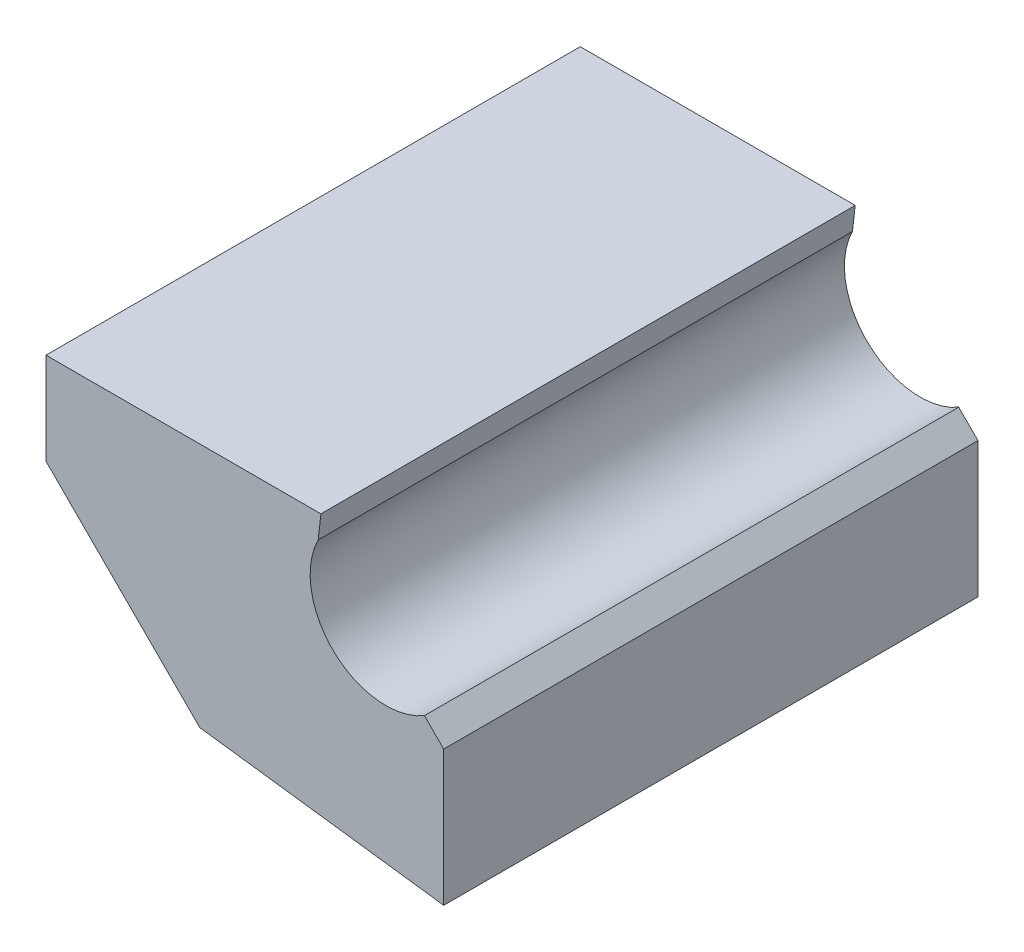
ISO-10303-21;
HEADER;
FILE_DESCRIPTION(('STEP AP214'),'2;1');
FILE_NAME('part.step','',(''),(''),'','','');
FILE_SCHEMA(('AUTOMOTIVE_DESIGN { 1 0 10303 214 1 1 1 1 }'));
ENDSEC;
DATA;
#1=APPLICATION_CONTEXT('core data for automotive mechanical design processes');
#2=APPLICATION_PROTOCOL_DEFINITION('international standard','automotive_design',2000,#1);
#3=PRODUCT_CONTEXT('',#1,'mechanical');
#4=PRODUCT('Part','Part','',(#3));
#5=PRODUCT_RELATED_PRODUCT_CATEGORY('part','',(#4));
#6=PRODUCT_DEFINITION_FORMATION('','',#4);
#7=PRODUCT_DEFINITION_CONTEXT('part definition',#1,'design');
#8=PRODUCT_DEFINITION('design','',#6,#7);
#9=PRODUCT_DEFINITION_SHAPE('','',#8);
#10=(LENGTH_UNIT() NAMED_UNIT(*) SI_UNIT(.MILLI.,.METRE.));
#11=(NAMED_UNIT(*) PLANE_ANGLE_UNIT() SI_UNIT($,.RADIAN.));
#12=(NAMED_UNIT(*) SI_UNIT($,.STERADIAN.) SOLID_ANGLE_UNIT());
#13=UNCERTAINTY_MEASURE_WITH_UNIT(LENGTH_MEASURE(1.E-05),#10,'distance_accuracy_value','');
#14=(GEOMETRIC_REPRESENTATION_CONTEXT(3) GLOBAL_UNCERTAINTY_ASSIGNED_CONTEXT((#13)) GLOBAL_UNIT_ASSIGNED_CONTEXT((#10,
#11,#12)) REPRESENTATION_CONTEXT('',''));
#15=CARTESIAN_POINT('',(0.,0.,0.));
#16=DIRECTION('',(0.,0.,1.));
#17=DIRECTION('',(1.,0.,0.));
#18=AXIS2_PLACEMENT_3D('',#15,#16,#17);
#19=CARTESIAN_POINT('',(-1.73973022761741,20.9381804961234,60.));
#20=DIRECTION('',(-1.,0.,0.));
#21=DIRECTION('',(0.,-1.,0.));
#22=AXIS2_PLACEMENT_3D('',#19,#20,#21);
#23=PLANE('',#22);
#24=DIRECTION('',(0.,1.,0.));
#25=VECTOR('',#24,1.);
#26=CARTESIAN_POINT('',(-1.73973022761741,20.9381804961234,0.));
#27=LINE('',#26,#25);
#28=CARTESIAN_POINT('',(-1.7397302276174,1.7397302276174,0.));
#29=VERTEX_POINT('',#28);
#30=CARTESIAN_POINT('',(-1.73973022761741,16.9381804961233,0.));
#31=VERTEX_POINT('',#30);
#32=EDGE_CURVE('E124',#29,#31,#27,.T.);
#33=ORIENTED_EDGE('',*,*,#32,.T.);
#34=DIRECTION('',(0.,0.,1.));
#35=VECTOR('',#34,1.);
#36=CARTESIAN_POINT('',(-1.73973022761741,16.9381804961233,60.));
#37=LINE('',#36,#35);
#38=CARTESIAN_POINT('',(-1.73973022761741,16.9381804961233,60.));
#39=VERTEX_POINT('',#38);
#40=EDGE_CURVE('E146',#31,#39,#37,.T.);
#41=ORIENTED_EDGE('',*,*,#40,.T.);
#42=DIRECTION('',(0.,1.,0.));
#43=VECTOR('',#42,1.);
#44=CARTESIAN_POINT('',(-1.73973022761741,20.9381804961234,60.));
#45=LINE('',#44,#43);
#46=CARTESIAN_POINT('',(-1.7397302276174,1.7397302276174,60.));
#47=VERTEX_POINT('',#46);
#48=EDGE_CURVE('E135',#47,#39,#45,.T.);
#49=ORIENTED_EDGE('',*,*,#48,.F.);
#50=DIRECTION('',(0.,0.,-1.));
#51=VECTOR('',#50,1.);
#52=CARTESIAN_POINT('',(-1.7397302276174,1.7397302276174,60.));
#53=LINE('',#52,#51);
#54=EDGE_CURVE('E116',#47,#29,#53,.T.);
#55=ORIENTED_EDGE('',*,*,#54,.T.);
#56=EDGE_LOOP('',(#33,#41,#49,#55));
#57=FACE_BOUND('',#56,.T.);
#58=ADVANCED_FACE('F33',(#57),#23,.F.);
#59=CARTESIAN_POINT('',(-8.23973022761739,26.415406071175,60.));
#60=DIRECTION('',(0.,0.,-1.));
#61=DIRECTION('',(-1.,0.,0.));
#62=AXIS2_PLACEMENT_3D('',#59,#60,#61);
#63=CYLINDRICAL_SURFACE('',#62,8.5);
#64=CARTESIAN_POINT('',(-8.23973022761739,26.415406071175,60.));
#65=DIRECTION('',(0.,0.,-1.));
#66=DIRECTION('',(1.,0.,0.));
#67=AXIS2_PLACEMENT_3D('',#64,#65,#66);
#68=CIRCLE('',#67,8.5);
#69=CARTESIAN_POINT('',(-3.90519678919163,19.1036470576976,60.));
#70=VERTEX_POINT('',#69);
#71=CARTESIAN_POINT('',(-15.8357207768003,30.2299738811273,60.));
#72=VERTEX_POINT('',#71);
#73=EDGE_CURVE('E108',#70,#72,#68,.T.);
#74=ORIENTED_EDGE('',*,*,#73,.F.);
#75=DIRECTION('',(0.,0.,-1.));
#76=VECTOR('',#75,1.);
#77=CARTESIAN_POINT('',(-3.90519678919163,19.1036470576976,60.));
#78=LINE('',#77,#76);
#79=CARTESIAN_POINT('',(-3.90519678919163,19.1036470576976,0.));
#80=VERTEX_POINT('',#79);
#81=EDGE_CURVE('E139',#70,#80,#78,.T.);
#82=ORIENTED_EDGE('',*,*,#81,.T.);
#83=CARTESIAN_POINT('',(-8.23973022761739,26.415406071175,0.));
#84=DIRECTION('',(0.,0.,-1.));
#85=DIRECTION('',(1.,0.,0.));
#86=AXIS2_PLACEMENT_3D('',#83,#84,#85);
#87=CIRCLE('',#86,8.5);
#88=CARTESIAN_POINT('',(-15.8357207768003,30.2299738811273,0.));
#89=VERTEX_POINT('',#88);
#90=EDGE_CURVE('E127',#80,#89,#87,.T.);
#91=ORIENTED_EDGE('',*,*,#90,.T.);
#92=DIRECTION('',(0.,0.,-1.));
#93=VECTOR('',#92,1.);
#94=CARTESIAN_POINT('',(-15.8357207768003,30.2299738811273,60.));
#95=LINE('',#94,#93);
#96=EDGE_CURVE('E115',#89,#72,#95,.F.);
#97=ORIENTED_EDGE('',*,*,#96,.T.);
#98=EDGE_LOOP('',(#74,#82,#91,#97));
#99=FACE_BOUND('',#98,.T.);
#100=ADVANCED_FACE('F175',(#99),#63,.F.);
#101=CARTESIAN_POINT('',(-46.4022226004261,32.915406071175,60.));
#102=DIRECTION('',(0.,-1.,0.));
#103=DIRECTION('',(0.,0.,-1.));
#104=AXIS2_PLACEMENT_3D('',#101,#102,#103);
#105=PLANE('',#104);
#106=DIRECTION('',(-1.,0.,0.));
#107=VECTOR('',#106,1.);
#108=CARTESIAN_POINT('',(-46.4022226004261,32.915406071175,60.));
#109=LINE('',#108,#107);
#110=CARTESIAN_POINT('',(-15.5304753879463,32.915406071175,60.));
#111=VERTEX_POINT('',#110);
#112=CARTESIAN_POINT('',(-46.4022226004261,32.915406071175,60.));
#113=VERTEX_POINT('',#112);
#114=EDGE_CURVE('E97',#111,#113,#109,.T.);
#115=ORIENTED_EDGE('',*,*,#114,.F.);
#116=DIRECTION('',(0.,0.,-1.));
#117=VECTOR('',#116,1.);
#118=CARTESIAN_POINT('',(-15.5304753879463,32.915406071175,60.));
#119=LINE('',#118,#117);
#120=CARTESIAN_POINT('',(-15.5304753879463,32.915406071175,0.));
#121=VERTEX_POINT('',#120);
#122=EDGE_CURVE('E151',#111,#121,#119,.T.);
#123=ORIENTED_EDGE('',*,*,#122,.T.);
#124=DIRECTION('',(-1.,0.,0.));
#125=VECTOR('',#124,1.);
#126=CARTESIAN_POINT('',(-46.4022226004261,32.915406071175,0.));
#127=LINE('',#126,#125);
#128=CARTESIAN_POINT('',(-46.4022226004261,32.915406071175,0.));
#129=VERTEX_POINT('',#128);
#130=EDGE_CURVE('E114',#121,#129,#127,.T.);
#131=ORIENTED_EDGE('',*,*,#130,.T.);
#132=DIRECTION('',(0.,0.,-1.));
#133=VECTOR('',#132,1.);
#134=CARTESIAN_POINT('',(-46.4022226004261,32.915406071175,60.));
#135=LINE('',#134,#133);
#136=EDGE_CURVE('E111',#113,#129,#135,.T.);
#137=ORIENTED_EDGE('',*,*,#136,.F.);
#138=EDGE_LOOP('',(#115,#123,#131,#137));
#139=FACE_BOUND('',#138,.T.);
#140=ADVANCED_FACE('F112',(#139),#105,.F.);
#141=CARTESIAN_POINT('',(-46.4022226004261,7.59296447097205,60.));
#142=DIRECTION('',(1.,0.,0.));
#143=DIRECTION('',(0.,0.,-1.));
#144=AXIS2_PLACEMENT_3D('',#141,#142,#143);
#145=PLANE('',#144);
#146=DIRECTION('',(0.,-1.,0.));
#147=VECTOR('',#146,1.);
#148=CARTESIAN_POINT('',(-46.4022226004261,7.59296447097205,0.));
#149=LINE('',#148,#147);
#150=CARTESIAN_POINT('',(-46.4022226004261,22.5929644709721,0.));
#151=VERTEX_POINT('',#150);
#152=EDGE_CURVE('E131',#129,#151,#149,.T.);
#153=ORIENTED_EDGE('',*,*,#152,.T.);
#154=DIRECTION('',(0.,0.,1.));
#155=VECTOR('',#154,1.);
#156=CARTESIAN_POINT('',(-46.4022226004261,22.5929644709721,60.));
#157=LINE('',#156,#155);
#158=CARTESIAN_POINT('',(-46.4022226004261,22.5929644709721,60.));
#159=VERTEX_POINT('',#158);
#160=EDGE_CURVE('E41',#151,#159,#157,.T.);
#161=ORIENTED_EDGE('',*,*,#160,.T.);
#162=DIRECTION('',(0.,-1.,0.));
#163=VECTOR('',#162,1.);
#164=CARTESIAN_POINT('',(-46.4022226004261,7.59296447097205,60.));
#165=LINE('',#164,#163);
#166=EDGE_CURVE('E100',#113,#159,#165,.T.);
#167=ORIENTED_EDGE('',*,*,#166,.F.);
#168=ORIENTED_EDGE('',*,*,#136,.T.);
#169=EDGE_LOOP('',(#153,#161,#167,#168));
#170=FACE_BOUND('',#169,.T.);
#171=ADVANCED_FACE('F118',(#170),#145,.F.);
#172=CARTESIAN_POINT('',(-1.7397302276174,1.7397302276174,60.));
#173=DIRECTION('',(0.12994364163226,0.991521381513958,0.));
#174=DIRECTION('',(-0.991521381513958,0.12994364163226,0.));
#175=AXIS2_PLACEMENT_3D('',#172,#173,#174);
#176=PLANE('',#175);
#177=DIRECTION('',(0.991521381513957,-0.12994364163226,0.));
#178=VECTOR('',#177,1.);
#179=CARTESIAN_POINT('',(-1.7397302276174,1.7397302276174,60.));
#180=LINE('',#179,#178);
#181=CARTESIAN_POINT('',(-29.1399141234784,5.33065599402424,60.));
#182=VERTEX_POINT('',#181);
#183=EDGE_CURVE('E119',#182,#47,#180,.T.);
#184=ORIENTED_EDGE('',*,*,#183,.F.);
#185=DIRECTION('',(0.,0.,-1.));
#186=VECTOR('',#185,1.);
#187=CARTESIAN_POINT('',(-29.1399141234784,5.33065599402424,60.));
#188=LINE('',#187,#186);
#189=CARTESIAN_POINT('',(-29.1399141234784,5.33065599402424,0.));
#190=VERTEX_POINT('',#189);
#191=EDGE_CURVE('E153',#182,#190,#188,.T.);
#192=ORIENTED_EDGE('',*,*,#191,.T.);
#193=DIRECTION('',(0.991521381513957,-0.12994364163226,0.));
#194=VECTOR('',#193,1.);
#195=CARTESIAN_POINT('',(-1.7397302276174,1.7397302276174,0.));
#196=LINE('',#195,#194);
#197=EDGE_CURVE('E133',#190,#29,#196,.T.);
#198=ORIENTED_EDGE('',*,*,#197,.T.);
#199=ORIENTED_EDGE('',*,*,#54,.F.);
#200=EDGE_LOOP('',(#184,#192,#198,#199));
#201=FACE_BOUND('',#200,.T.);
#202=ADVANCED_FACE('F159',(#201),#176,.F.);
#203=CARTESIAN_POINT('',(-8.23973022761739,26.415406071175,60.));
#204=DIRECTION('',(0.,0.,1.));
#205=DIRECTION('',(1.,0.,0.));
#206=AXIS2_PLACEMENT_3D('',#203,#204,#205);
#207=PLANE('',#206);
#208=ORIENTED_EDGE('',*,*,#166,.T.);
#209=DIRECTION('',(-0.707106781186546,0.707106781186549,0.));
#210=VECTOR('',#209,1.);
#211=CARTESIAN_POINT('',(-29.2321972141233,5.4229390846692,60.));
#212=LINE('',#211,#210);
#213=EDGE_CURVE('E11',#159,#182,#212,.F.);
#214=ORIENTED_EDGE('',*,*,#213,.T.);
#215=ORIENTED_EDGE('',*,*,#183,.T.);
#216=ORIENTED_EDGE('',*,*,#48,.T.);
#217=DIRECTION('',(0.707106781186545,-0.70710678118655,0.));
#218=VECTOR('',#217,1.);
#219=CARTESIAN_POINT('',(-9.72834301514323,24.9267932836492,60.));
#220=LINE('',#219,#218);
#221=EDGE_CURVE('E149',#39,#70,#220,.F.);
#222=ORIENTED_EDGE('',*,*,#221,.T.);
#223=ORIENTED_EDGE('',*,*,#73,.T.);
#224=DIRECTION('',(-0.11293987472967,-0.993601824020088,0.));
#225=VECTOR('',#224,1.);
#226=CARTESIAN_POINT('',(-16.166891131535,27.3164637562627,60.));
#227=LINE('',#226,#225);
#228=EDGE_CURVE('E104',#72,#111,#227,.F.);
#229=ORIENTED_EDGE('',*,*,#228,.T.);
#230=ORIENTED_EDGE('',*,*,#114,.T.);
#231=EDGE_LOOP('',(#208,#214,#215,#216,#222,#223,#229,#230));
#232=FACE_BOUND('',#231,.T.);
#233=ADVANCED_FACE('F99',(#232),#207,.T.);
#234=CARTESIAN_POINT('',(-8.23973022761739,26.415406071175,0.));
#235=DIRECTION('',(0.,0.,1.));
#236=DIRECTION('',(1.,0.,0.));
#237=AXIS2_PLACEMENT_3D('',#234,#235,#236);
#238=PLANE('',#237);
#239=ORIENTED_EDGE('',*,*,#197,.F.);
#240=DIRECTION('',(0.707106781186546,-0.707106781186549,0.));
#241=VECTOR('',#240,1.);
#242=CARTESIAN_POINT('',(-29.1399141234784,5.33065599402424,0.));
#243=LINE('',#242,#241);
#244=EDGE_CURVE('E55',#190,#151,#243,.F.);
#245=ORIENTED_EDGE('',*,*,#244,.T.);
#246=ORIENTED_EDGE('',*,*,#152,.F.);
#247=ORIENTED_EDGE('',*,*,#130,.F.);
#248=DIRECTION('',(0.11293987472967,0.993601824020088,0.));
#249=VECTOR('',#248,1.);
#250=CARTESIAN_POINT('',(-15.5304753879463,32.915406071175,0.));
#251=LINE('',#250,#249);
#252=EDGE_CURVE('E142',#121,#89,#251,.F.);
#253=ORIENTED_EDGE('',*,*,#252,.T.);
#254=ORIENTED_EDGE('',*,*,#90,.F.);
#255=DIRECTION('',(-0.707106781186545,0.70710678118655,0.));
#256=VECTOR('',#255,1.);
#257=CARTESIAN_POINT('',(-3.90519678919163,19.1036470576976,0.));
#258=LINE('',#257,#256);
#259=EDGE_CURVE('E144',#80,#31,#258,.F.);
#260=ORIENTED_EDGE('',*,*,#259,.T.);
#261=ORIENTED_EDGE('',*,*,#32,.F.);
#262=EDGE_LOOP('',(#239,#245,#246,#247,#253,#254,#260,#261));
#263=FACE_BOUND('',#262,.T.);
#264=ADVANCED_FACE('F163',(#263),#238,.F.);
#265=CARTESIAN_POINT('',(-3.90519678919163,19.1036470576976,60.));
#266=DIRECTION('',(-0.70710678118655,-0.707106781186545,0.));
#267=DIRECTION('',(0.,0.,-1.));
#268=AXIS2_PLACEMENT_3D('',#265,#266,#267);
#269=PLANE('',#268);
#270=ORIENTED_EDGE('',*,*,#221,.F.);
#271=ORIENTED_EDGE('',*,*,#40,.F.);
#272=ORIENTED_EDGE('',*,*,#259,.F.);
#273=ORIENTED_EDGE('',*,*,#81,.F.);
#274=EDGE_LOOP('',(#270,#271,#272,#273));
#275=FACE_BOUND('',#274,.T.);
#276=ADVANCED_FACE('F171',(#275),#269,.F.);
#277=CARTESIAN_POINT('',(-15.5304753879463,32.915406071175,60.));
#278=DIRECTION('',(-0.993601824020088,0.11293987472967,0.));
#279=DIRECTION('',(0.,0.,-1.));
#280=AXIS2_PLACEMENT_3D('',#277,#278,#279);
#281=PLANE('',#280);
#282=ORIENTED_EDGE('',*,*,#228,.F.);
#283=ORIENTED_EDGE('',*,*,#96,.F.);
#284=ORIENTED_EDGE('',*,*,#252,.F.);
#285=ORIENTED_EDGE('',*,*,#122,.F.);
#286=EDGE_LOOP('',(#282,#283,#284,#285));
#287=FACE_BOUND('',#286,.T.);
#288=ADVANCED_FACE('F179',(#287),#281,.F.);
#289=CARTESIAN_POINT('',(-29.1399141234784,5.33065599402424,60.));
#290=DIRECTION('',(0.707106781186549,0.707106781186546,0.));
#291=DIRECTION('',(0.,0.,-1.));
#292=AXIS2_PLACEMENT_3D('',#289,#290,#291);
#293=PLANE('',#292);
#294=ORIENTED_EDGE('',*,*,#213,.F.);
#295=ORIENTED_EDGE('',*,*,#160,.F.);
#296=ORIENTED_EDGE('',*,*,#244,.F.);
#297=ORIENTED_EDGE('',*,*,#191,.F.);
#298=EDGE_LOOP('',(#294,#295,#296,#297));
#299=FACE_BOUND('',#298,.T.);
#300=ADVANCED_FACE('F35',(#299),#293,.F.);
#301=CLOSED_SHELL('',(#58,#100,#140,#171,#202,#233,#264,#276,#288,#300));
#302=MANIFOLD_SOLID_BREP('B2',#301);
#303=ADVANCED_BREP_SHAPE_REPRESENTATION('',(#18,#302),#14);
#304=SHAPE_DEFINITION_REPRESENTATION(#9,#303);
ENDSEC;
END-ISO-10303-21;
